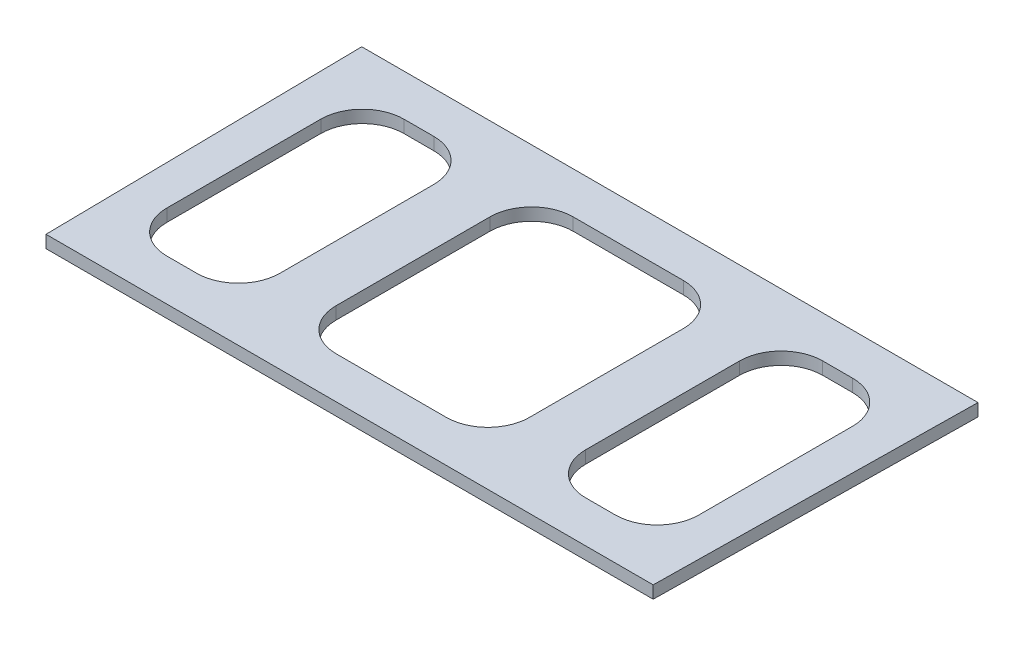
ISO-10303-21;
HEADER;
FILE_DESCRIPTION(('STEP AP214'),'2;1');
FILE_NAME('part.step','',(''),(''),'','','');
FILE_SCHEMA(('AUTOMOTIVE_DESIGN { 1 0 10303 214 1 1 1 1 }'));
ENDSEC;
DATA;
#1=APPLICATION_CONTEXT('core data for automotive mechanical design processes');
#2=APPLICATION_PROTOCOL_DEFINITION('international standard','automotive_design',2000,#1);
#3=PRODUCT_CONTEXT('',#1,'mechanical');
#4=PRODUCT('Part','Part','',(#3));
#5=PRODUCT_RELATED_PRODUCT_CATEGORY('part','',(#4));
#6=PRODUCT_DEFINITION_FORMATION('','',#4);
#7=PRODUCT_DEFINITION_CONTEXT('part definition',#1,'design');
#8=PRODUCT_DEFINITION('design','',#6,#7);
#9=PRODUCT_DEFINITION_SHAPE('','',#8);
#10=(LENGTH_UNIT() NAMED_UNIT(*) SI_UNIT(.MILLI.,.METRE.));
#11=(NAMED_UNIT(*) PLANE_ANGLE_UNIT() SI_UNIT($,.RADIAN.));
#12=(NAMED_UNIT(*) SI_UNIT($,.STERADIAN.) SOLID_ANGLE_UNIT());
#13=UNCERTAINTY_MEASURE_WITH_UNIT(LENGTH_MEASURE(1.E-05),#10,'distance_accuracy_value','');
#14=(GEOMETRIC_REPRESENTATION_CONTEXT(3) GLOBAL_UNCERTAINTY_ASSIGNED_CONTEXT((#13)) GLOBAL_UNIT_ASSIGNED_CONTEXT((#10,
#11,#12)) REPRESENTATION_CONTEXT('',''));
#15=CARTESIAN_POINT('',(0.,0.,0.));
#16=DIRECTION('',(0.,0.,1.));
#17=DIRECTION('',(1.,0.,0.));
#18=AXIS2_PLACEMENT_3D('',#15,#16,#17);
#19=CARTESIAN_POINT('',(0.,3.,0.));
#20=DIRECTION('',(0.,1.,0.));
#21=DIRECTION('',(0.,0.,1.));
#22=AXIS2_PLACEMENT_3D('',#19,#20,#21);
#23=PLANE('',#22);
#24=CARTESIAN_POINT('',(-46.75,3.,-57.));
#25=DIRECTION('',(0.,1.,0.));
#26=DIRECTION('',(0.,0.,-1.));
#27=AXIS2_PLACEMENT_3D('',#24,#25,#26);
#28=CIRCLE('',#27,9.99999999999999);
#29=CARTESIAN_POINT('',(-36.75,3.,-56.9999999999999));
#30=VERTEX_POINT('',#29);
#31=CARTESIAN_POINT('',(-46.7500000000001,3.,-67.));
#32=VERTEX_POINT('',#31);
#33=EDGE_CURVE('E302',#30,#32,#28,.T.);
#34=ORIENTED_EDGE('',*,*,#33,.F.);
#35=DIRECTION('',(0.,0.,-1.));
#36=VECTOR('',#35,1.);
#37=CARTESIAN_POINT('',(-36.75,3.,-56.9999999999999));
#38=LINE('',#37,#36);
#39=CARTESIAN_POINT('',(-36.75,3.,-20.0000000000001));
#40=VERTEX_POINT('',#39);
#41=EDGE_CURVE('E319',#40,#30,#38,.T.);
#42=ORIENTED_EDGE('',*,*,#41,.F.);
#43=CARTESIAN_POINT('',(-46.75,3.,-20.));
#44=DIRECTION('',(0.,1.,0.));
#45=DIRECTION('',(0.,0.,-1.));
#46=AXIS2_PLACEMENT_3D('',#43,#44,#45);
#47=CIRCLE('',#46,10.);
#48=CARTESIAN_POINT('',(-46.7500000000001,3.,-10.));
#49=VERTEX_POINT('',#48);
#50=EDGE_CURVE('E335',#49,#40,#47,.T.);
#51=ORIENTED_EDGE('',*,*,#50,.F.);
#52=DIRECTION('',(1.,0.,0.));
#53=VECTOR('',#52,1.);
#54=CARTESIAN_POINT('',(-46.7500000000001,3.,-10.));
#55=LINE('',#54,#53);
#56=CARTESIAN_POINT('',(-53.9326195310102,3.,-10.));
#57=VERTEX_POINT('',#56);
#58=EDGE_CURVE('E338',#57,#49,#55,.T.);
#59=ORIENTED_EDGE('',*,*,#58,.F.);
#60=CARTESIAN_POINT('',(-53.9326195310102,3.,-20.));
#61=DIRECTION('',(0.,1.,0.));
#62=DIRECTION('',(0.,0.,-1.));
#63=AXIS2_PLACEMENT_3D('',#60,#61,#62);
#64=CIRCLE('',#63,10.);
#65=CARTESIAN_POINT('',(-63.9326195310102,3.,-20.0000000000001));
#66=VERTEX_POINT('',#65);
#67=EDGE_CURVE('E341',#66,#57,#64,.T.);
#68=ORIENTED_EDGE('',*,*,#67,.F.);
#69=DIRECTION('',(0.,0.,1.));
#70=VECTOR('',#69,1.);
#71=CARTESIAN_POINT('',(-63.9326195310102,3.,-56.9999999999999));
#72=LINE('',#71,#70);
#73=CARTESIAN_POINT('',(-63.9326195310102,3.,-56.9999999999999));
#74=VERTEX_POINT('',#73);
#75=EDGE_CURVE('E344',#74,#66,#72,.T.);
#76=ORIENTED_EDGE('',*,*,#75,.F.);
#77=CARTESIAN_POINT('',(-53.9326195310102,3.,-57.));
#78=DIRECTION('',(0.,1.,0.));
#79=DIRECTION('',(0.,0.,1.));
#80=AXIS2_PLACEMENT_3D('',#77,#78,#79);
#81=CIRCLE('',#80,10.);
#82=CARTESIAN_POINT('',(-53.9326195310102,3.,-67.));
#83=VERTEX_POINT('',#82);
#84=EDGE_CURVE('E347',#83,#74,#81,.T.);
#85=ORIENTED_EDGE('',*,*,#84,.F.);
#86=DIRECTION('',(-1.,0.,0.));
#87=VECTOR('',#86,1.);
#88=CARTESIAN_POINT('',(-46.7500000000001,3.,-67.));
#89=LINE('',#88,#87);
#90=EDGE_CURVE('E350',#32,#83,#89,.T.);
#91=ORIENTED_EDGE('',*,*,#90,.F.);
#92=EDGE_LOOP('',(#34,#42,#51,#59,#68,#76,#85,#91));
#93=FACE_BOUND('',#92,.T.);
#94=DIRECTION('',(0.0141366960380366,0.,-0.999900071919753));
#95=VECTOR('',#94,1.);
#96=CARTESIAN_POINT('',(74.075,3.,-77.));
#97=LINE('',#96,#95);
#98=CARTESIAN_POINT('',(72.9863656199275,3.,0.));
#99=VERTEX_POINT('',#98);
#100=CARTESIAN_POINT('',(74.075,3.,-77.));
#101=VERTEX_POINT('',#100);
#102=EDGE_CURVE('E354',#99,#101,#97,.T.);
#103=ORIENTED_EDGE('',*,*,#102,.T.);
#104=DIRECTION('',(-1.,0.,0.));
#105=VECTOR('',#104,1.);
#106=CARTESIAN_POINT('',(-74.075,3.,-77.));
#107=LINE('',#106,#105);
#108=CARTESIAN_POINT('',(-74.075,3.,-77.));
#109=VERTEX_POINT('',#108);
#110=EDGE_CURVE('E357',#101,#109,#107,.T.);
#111=ORIENTED_EDGE('',*,*,#110,.T.);
#112=DIRECTION('',(0.0141366960380362,0.,0.999900071919753));
#113=VECTOR('',#112,1.);
#114=CARTESIAN_POINT('',(-72.9863656199275,3.,0.));
#115=LINE('',#114,#113);
#116=CARTESIAN_POINT('',(-72.9863656199275,3.,0.));
#117=VERTEX_POINT('',#116);
#118=EDGE_CURVE('E360',#109,#117,#115,.T.);
#119=ORIENTED_EDGE('',*,*,#118,.T.);
#120=DIRECTION('',(1.,0.,0.));
#121=VECTOR('',#120,1.);
#122=CARTESIAN_POINT('',(-72.9863656199275,3.,0.));
#123=LINE('',#122,#121);
#124=EDGE_CURVE('E362',#117,#99,#123,.T.);
#125=ORIENTED_EDGE('',*,*,#124,.T.);
#126=EDGE_LOOP('',(#103,#111,#119,#125));
#127=FACE_BOUND('',#126,.T.);
#128=DIRECTION('',(0.,0.,-1.));
#129=VECTOR('',#128,1.);
#130=CARTESIAN_POINT('',(36.75,3.,-56.9999999999999));
#131=LINE('',#130,#129);
#132=CARTESIAN_POINT('',(36.75,3.,-20.0000000000001));
#133=VERTEX_POINT('',#132);
#134=CARTESIAN_POINT('',(36.75,3.,-56.9999999999999));
#135=VERTEX_POINT('',#134);
#136=EDGE_CURVE('E265',#133,#135,#131,.T.);
#137=ORIENTED_EDGE('',*,*,#136,.T.);
#138=CARTESIAN_POINT('',(46.75,3.,-57.));
#139=DIRECTION('',(0.,-1.,0.));
#140=DIRECTION('',(0.,0.,-1.));
#141=AXIS2_PLACEMENT_3D('',#138,#139,#140);
#142=CIRCLE('',#141,9.99999999999999);
#143=CARTESIAN_POINT('',(46.7500000000001,3.,-67.));
#144=VERTEX_POINT('',#143);
#145=EDGE_CURVE('E52',#135,#144,#142,.T.);
#146=ORIENTED_EDGE('',*,*,#145,.T.);
#147=DIRECTION('',(1.,0.,0.));
#148=VECTOR('',#147,1.);
#149=CARTESIAN_POINT('',(46.7500000000001,3.,-67.));
#150=LINE('',#149,#148);
#151=CARTESIAN_POINT('',(53.9326195310102,3.,-67.));
#152=VERTEX_POINT('',#151);
#153=EDGE_CURVE('E283',#144,#152,#150,.T.);
#154=ORIENTED_EDGE('',*,*,#153,.T.);
#155=CARTESIAN_POINT('',(53.9326195310102,3.,-57.));
#156=DIRECTION('',(0.,-1.,0.));
#157=DIRECTION('',(0.,0.,1.));
#158=AXIS2_PLACEMENT_3D('',#155,#156,#157);
#159=CIRCLE('',#158,10.);
#160=CARTESIAN_POINT('',(63.9326195310102,3.,-56.9999999999999));
#161=VERTEX_POINT('',#160);
#162=EDGE_CURVE('E280',#152,#161,#159,.T.);
#163=ORIENTED_EDGE('',*,*,#162,.T.);
#164=DIRECTION('',(0.,0.,1.));
#165=VECTOR('',#164,1.);
#166=CARTESIAN_POINT('',(63.9326195310102,3.,-56.9999999999999));
#167=LINE('',#166,#165);
#168=CARTESIAN_POINT('',(63.9326195310102,3.,-20.0000000000001));
#169=VERTEX_POINT('',#168);
#170=EDGE_CURVE('E277',#161,#169,#167,.T.);
#171=ORIENTED_EDGE('',*,*,#170,.T.);
#172=CARTESIAN_POINT('',(53.9326195310102,3.,-20.));
#173=DIRECTION('',(0.,-1.,0.));
#174=DIRECTION('',(0.,0.,-1.));
#175=AXIS2_PLACEMENT_3D('',#172,#173,#174);
#176=CIRCLE('',#175,10.);
#177=CARTESIAN_POINT('',(53.9326195310102,3.,-10.));
#178=VERTEX_POINT('',#177);
#179=EDGE_CURVE('E274',#169,#178,#176,.T.);
#180=ORIENTED_EDGE('',*,*,#179,.T.);
#181=DIRECTION('',(-1.,0.,0.));
#182=VECTOR('',#181,1.);
#183=CARTESIAN_POINT('',(46.7500000000001,3.,-10.));
#184=LINE('',#183,#182);
#185=CARTESIAN_POINT('',(46.7500000000001,3.,-10.));
#186=VERTEX_POINT('',#185);
#187=EDGE_CURVE('E271',#178,#186,#184,.T.);
#188=ORIENTED_EDGE('',*,*,#187,.T.);
#189=CARTESIAN_POINT('',(46.75,3.,-20.));
#190=DIRECTION('',(0.,-1.,0.));
#191=DIRECTION('',(0.,0.,-1.));
#192=AXIS2_PLACEMENT_3D('',#189,#190,#191);
#193=CIRCLE('',#192,10.);
#194=EDGE_CURVE('E268',#186,#133,#193,.T.);
#195=ORIENTED_EDGE('',*,*,#194,.T.);
#196=EDGE_LOOP('',(#137,#146,#154,#163,#171,#180,#188,#195));
#197=FACE_BOUND('',#196,.T.);
#198=DIRECTION('',(-1.,0.,0.));
#199=VECTOR('',#198,1.);
#200=CARTESIAN_POINT('',(-13.2499999999999,3.,-67.));
#201=LINE('',#200,#199);
#202=CARTESIAN_POINT('',(13.2499999999999,3.,-67.));
#203=VERTEX_POINT('',#202);
#204=CARTESIAN_POINT('',(-13.2499999999999,3.,-67.));
#205=VERTEX_POINT('',#204);
#206=EDGE_CURVE('E298',#203,#205,#201,.T.);
#207=ORIENTED_EDGE('',*,*,#206,.F.);
#208=CARTESIAN_POINT('',(13.25,3.,-57.));
#209=DIRECTION('',(0.,-1.,0.));
#210=DIRECTION('',(0.,0.,1.));
#211=AXIS2_PLACEMENT_3D('',#208,#209,#210);
#212=CIRCLE('',#211,10.);
#213=CARTESIAN_POINT('',(23.25,3.,-56.9999999999999));
#214=VERTEX_POINT('',#213);
#215=EDGE_CURVE('E245',#203,#214,#212,.T.);
#216=ORIENTED_EDGE('',*,*,#215,.T.);
#217=DIRECTION('',(0.,0.,1.));
#218=VECTOR('',#217,1.);
#219=CARTESIAN_POINT('',(23.25,3.,-56.9999999999999));
#220=LINE('',#219,#218);
#221=CARTESIAN_POINT('',(23.25,3.,-20.0000000000001));
#222=VERTEX_POINT('',#221);
#223=EDGE_CURVE('E249',#214,#222,#220,.T.);
#224=ORIENTED_EDGE('',*,*,#223,.T.);
#225=CARTESIAN_POINT('',(13.25,3.,-20.));
#226=DIRECTION('',(0.,-1.,0.));
#227=DIRECTION('',(0.,0.,1.));
#228=AXIS2_PLACEMENT_3D('',#225,#226,#227);
#229=CIRCLE('',#228,10.);
#230=CARTESIAN_POINT('',(13.2499999999999,3.,-10.));
#231=VERTEX_POINT('',#230);
#232=EDGE_CURVE('E240',#222,#231,#229,.T.);
#233=ORIENTED_EDGE('',*,*,#232,.T.);
#234=DIRECTION('',(1.,0.,0.));
#235=VECTOR('',#234,1.);
#236=CARTESIAN_POINT('',(-13.2499999999999,3.,-10.));
#237=LINE('',#236,#235);
#238=CARTESIAN_POINT('',(-13.2499999999999,3.,-10.));
#239=VERTEX_POINT('',#238);
#240=EDGE_CURVE('E222',#239,#231,#237,.T.);
#241=ORIENTED_EDGE('',*,*,#240,.F.);
#242=CARTESIAN_POINT('',(-13.25,3.,-20.));
#243=DIRECTION('',(0.,1.,0.));
#244=DIRECTION('',(0.,0.,1.));
#245=AXIS2_PLACEMENT_3D('',#242,#243,#244);
#246=CIRCLE('',#245,10.);
#247=CARTESIAN_POINT('',(-23.25,3.,-20.0000000000001));
#248=VERTEX_POINT('',#247);
#249=EDGE_CURVE('E233',#248,#239,#246,.T.);
#250=ORIENTED_EDGE('',*,*,#249,.F.);
#251=DIRECTION('',(0.,0.,1.));
#252=VECTOR('',#251,1.);
#253=CARTESIAN_POINT('',(-23.25,3.,-56.9999999999999));
#254=LINE('',#253,#252);
#255=CARTESIAN_POINT('',(-23.25,3.,-56.9999999999999));
#256=VERTEX_POINT('',#255);
#257=EDGE_CURVE('E305',#256,#248,#254,.T.);
#258=ORIENTED_EDGE('',*,*,#257,.F.);
#259=CARTESIAN_POINT('',(-13.25,3.,-57.));
#260=DIRECTION('',(0.,1.,0.));
#261=DIRECTION('',(0.,0.,1.));
#262=AXIS2_PLACEMENT_3D('',#259,#260,#261);
#263=CIRCLE('',#262,10.);
#264=EDGE_CURVE('E301',#205,#256,#263,.T.);
#265=ORIENTED_EDGE('',*,*,#264,.F.);
#266=EDGE_LOOP('',(#207,#216,#224,#233,#241,#250,#258,#265));
#267=FACE_BOUND('',#266,.T.);
#268=ADVANCED_FACE('F37',(#93,#127,#197,#267),#23,.T.);
#269=CARTESIAN_POINT('',(0.,0.,0.));
#270=DIRECTION('',(0.,1.,0.));
#271=DIRECTION('',(0.,0.,1.));
#272=AXIS2_PLACEMENT_3D('',#269,#270,#271);
#273=PLANE('',#272);
#274=CARTESIAN_POINT('',(46.75,0.,-57.));
#275=DIRECTION('',(0.,1.,0.));
#276=DIRECTION('',(0.,0.,1.));
#277=AXIS2_PLACEMENT_3D('',#274,#275,#276);
#278=CIRCLE('',#277,9.99999999999999);
#279=CARTESIAN_POINT('',(36.75,0.,-56.9999999999999));
#280=VERTEX_POINT('',#279);
#281=CARTESIAN_POINT('',(46.7500000000001,0.,-67.));
#282=VERTEX_POINT('',#281);
#283=EDGE_CURVE('E435',#280,#282,#278,.F.);
#284=ORIENTED_EDGE('',*,*,#283,.F.);
#285=DIRECTION('',(0.,0.,-1.));
#286=VECTOR('',#285,1.);
#287=CARTESIAN_POINT('',(36.75,0.,0.));
#288=LINE('',#287,#286);
#289=CARTESIAN_POINT('',(36.75,0.,-20.0000000000001));
#290=VERTEX_POINT('',#289);
#291=EDGE_CURVE('E421',#290,#280,#288,.T.);
#292=ORIENTED_EDGE('',*,*,#291,.F.);
#293=CARTESIAN_POINT('',(46.75,0.,-20.));
#294=DIRECTION('',(0.,1.,0.));
#295=DIRECTION('',(0.,0.,1.));
#296=AXIS2_PLACEMENT_3D('',#293,#294,#295);
#297=CIRCLE('',#296,10.);
#298=CARTESIAN_POINT('',(46.7500000000001,0.,-10.));
#299=VERTEX_POINT('',#298);
#300=EDGE_CURVE('E423',#299,#290,#297,.F.);
#301=ORIENTED_EDGE('',*,*,#300,.F.);
#302=DIRECTION('',(-1.,0.,0.));
#303=VECTOR('',#302,1.);
#304=CARTESIAN_POINT('',(0.,0.,-10.));
#305=LINE('',#304,#303);
#306=CARTESIAN_POINT('',(53.9326195310102,0.,-10.));
#307=VERTEX_POINT('',#306);
#308=EDGE_CURVE('E425',#307,#299,#305,.T.);
#309=ORIENTED_EDGE('',*,*,#308,.F.);
#310=CARTESIAN_POINT('',(53.9326195310102,0.,-20.));
#311=DIRECTION('',(0.,1.,0.));
#312=DIRECTION('',(0.,0.,1.));
#313=AXIS2_PLACEMENT_3D('',#310,#311,#312);
#314=CIRCLE('',#313,10.);
#315=CARTESIAN_POINT('',(63.9326195310102,0.,-20.0000000000001));
#316=VERTEX_POINT('',#315);
#317=EDGE_CURVE('E427',#316,#307,#314,.F.);
#318=ORIENTED_EDGE('',*,*,#317,.F.);
#319=DIRECTION('',(0.,0.,1.));
#320=VECTOR('',#319,1.);
#321=CARTESIAN_POINT('',(63.9326195310102,0.,0.));
#322=LINE('',#321,#320);
#323=CARTESIAN_POINT('',(63.9326195310102,0.,-56.9999999999999));
#324=VERTEX_POINT('',#323);
#325=EDGE_CURVE('E429',#324,#316,#322,.T.);
#326=ORIENTED_EDGE('',*,*,#325,.F.);
#327=CARTESIAN_POINT('',(53.9326195310102,0.,-57.));
#328=DIRECTION('',(0.,1.,0.));
#329=DIRECTION('',(0.,0.,1.));
#330=AXIS2_PLACEMENT_3D('',#327,#328,#329);
#331=CIRCLE('',#330,10.);
#332=CARTESIAN_POINT('',(53.9326195310102,0.,-67.));
#333=VERTEX_POINT('',#332);
#334=EDGE_CURVE('E431',#333,#324,#331,.F.);
#335=ORIENTED_EDGE('',*,*,#334,.F.);
#336=DIRECTION('',(1.,0.,0.));
#337=VECTOR('',#336,1.);
#338=CARTESIAN_POINT('',(0.,0.,-67.));
#339=LINE('',#338,#337);
#340=EDGE_CURVE('E433',#282,#333,#339,.T.);
#341=ORIENTED_EDGE('',*,*,#340,.F.);
#342=EDGE_LOOP('',(#284,#292,#301,#309,#318,#326,#335,#341));
#343=FACE_BOUND('',#342,.T.);
#344=DIRECTION('',(0.,0.,-1.));
#345=VECTOR('',#344,1.);
#346=CARTESIAN_POINT('',(-36.75,0.,0.));
#347=LINE('',#346,#345);
#348=CARTESIAN_POINT('',(-36.75,0.,-20.0000000000001));
#349=VERTEX_POINT('',#348);
#350=CARTESIAN_POINT('',(-36.75,0.,-56.9999999999999));
#351=VERTEX_POINT('',#350);
#352=EDGE_CURVE('E401',#349,#351,#347,.T.);
#353=ORIENTED_EDGE('',*,*,#352,.T.);
#354=CARTESIAN_POINT('',(-46.75,0.,-57.));
#355=DIRECTION('',(0.,1.,0.));
#356=DIRECTION('',(0.,0.,1.));
#357=AXIS2_PLACEMENT_3D('',#354,#355,#356);
#358=CIRCLE('',#357,9.99999999999999);
#359=CARTESIAN_POINT('',(-46.7500000000001,0.,-67.));
#360=VERTEX_POINT('',#359);
#361=EDGE_CURVE('E404',#351,#360,#358,.T.);
#362=ORIENTED_EDGE('',*,*,#361,.T.);
#363=DIRECTION('',(-1.,0.,0.));
#364=VECTOR('',#363,1.);
#365=CARTESIAN_POINT('',(0.,0.,-67.));
#366=LINE('',#365,#364);
#367=CARTESIAN_POINT('',(-53.9326195310102,0.,-67.));
#368=VERTEX_POINT('',#367);
#369=EDGE_CURVE('E383',#360,#368,#366,.T.);
#370=ORIENTED_EDGE('',*,*,#369,.T.);
#371=CARTESIAN_POINT('',(-53.9326195310102,0.,-57.));
#372=DIRECTION('',(0.,1.,0.));
#373=DIRECTION('',(0.,0.,1.));
#374=AXIS2_PLACEMENT_3D('',#371,#372,#373);
#375=CIRCLE('',#374,10.);
#376=CARTESIAN_POINT('',(-63.9326195310102,0.,-56.9999999999999));
#377=VERTEX_POINT('',#376);
#378=EDGE_CURVE('E386',#368,#377,#375,.T.);
#379=ORIENTED_EDGE('',*,*,#378,.T.);
#380=DIRECTION('',(0.,0.,1.));
#381=VECTOR('',#380,1.);
#382=CARTESIAN_POINT('',(-63.9326195310102,0.,0.));
#383=LINE('',#382,#381);
#384=CARTESIAN_POINT('',(-63.9326195310102,0.,-20.0000000000001));
#385=VERTEX_POINT('',#384);
#386=EDGE_CURVE('E389',#377,#385,#383,.T.);
#387=ORIENTED_EDGE('',*,*,#386,.T.);
#388=CARTESIAN_POINT('',(-53.9326195310102,0.,-20.));
#389=DIRECTION('',(0.,1.,0.));
#390=DIRECTION('',(0.,0.,1.));
#391=AXIS2_PLACEMENT_3D('',#388,#389,#390);
#392=CIRCLE('',#391,10.);
#393=CARTESIAN_POINT('',(-53.9326195310102,0.,-10.));
#394=VERTEX_POINT('',#393);
#395=EDGE_CURVE('E392',#385,#394,#392,.T.);
#396=ORIENTED_EDGE('',*,*,#395,.T.);
#397=DIRECTION('',(1.,0.,0.));
#398=VECTOR('',#397,1.);
#399=CARTESIAN_POINT('',(0.,0.,-10.));
#400=LINE('',#399,#398);
#401=CARTESIAN_POINT('',(-46.7500000000001,0.,-10.));
#402=VERTEX_POINT('',#401);
#403=EDGE_CURVE('E395',#394,#402,#400,.T.);
#404=ORIENTED_EDGE('',*,*,#403,.T.);
#405=CARTESIAN_POINT('',(-46.75,0.,-20.));
#406=DIRECTION('',(0.,1.,0.));
#407=DIRECTION('',(0.,0.,1.));
#408=AXIS2_PLACEMENT_3D('',#405,#406,#407);
#409=CIRCLE('',#408,10.);
#410=EDGE_CURVE('E398',#402,#349,#409,.T.);
#411=ORIENTED_EDGE('',*,*,#410,.T.);
#412=EDGE_LOOP('',(#353,#362,#370,#379,#387,#396,#404,#411));
#413=FACE_BOUND('',#412,.T.);
#414=DIRECTION('',(0.0141366960380366,0.,-0.999900071919753));
#415=VECTOR('',#414,1.);
#416=CARTESIAN_POINT('',(74.075,0.,-77.));
#417=LINE('',#416,#415);
#418=CARTESIAN_POINT('',(72.9863656199275,0.,0.));
#419=VERTEX_POINT('',#418);
#420=CARTESIAN_POINT('',(74.075,0.,-77.));
#421=VERTEX_POINT('',#420);
#422=EDGE_CURVE('E310',#419,#421,#417,.T.);
#423=ORIENTED_EDGE('',*,*,#422,.F.);
#424=DIRECTION('',(1.,0.,0.));
#425=VECTOR('',#424,1.);
#426=CARTESIAN_POINT('',(-72.9863656199275,0.,0.));
#427=LINE('',#426,#425);
#428=CARTESIAN_POINT('',(-72.9863656199275,0.,0.));
#429=VERTEX_POINT('',#428);
#430=EDGE_CURVE('E358',#429,#419,#427,.T.);
#431=ORIENTED_EDGE('',*,*,#430,.F.);
#432=DIRECTION('',(0.0141366960380362,0.,0.999900071919753));
#433=VECTOR('',#432,1.);
#434=CARTESIAN_POINT('',(-72.9863656199275,0.,0.));
#435=LINE('',#434,#433);
#436=CARTESIAN_POINT('',(-74.075,0.,-77.));
#437=VERTEX_POINT('',#436);
#438=EDGE_CURVE('E369',#437,#429,#435,.T.);
#439=ORIENTED_EDGE('',*,*,#438,.F.);
#440=DIRECTION('',(-1.,0.,0.));
#441=VECTOR('',#440,1.);
#442=CARTESIAN_POINT('',(-74.075,0.,-77.));
#443=LINE('',#442,#441);
#444=EDGE_CURVE('E367',#421,#437,#443,.T.);
#445=ORIENTED_EDGE('',*,*,#444,.F.);
#446=EDGE_LOOP('',(#423,#431,#439,#445));
#447=FACE_BOUND('',#446,.T.);
#448=CARTESIAN_POINT('',(13.25,0.,-57.));
#449=DIRECTION('',(0.,1.,0.));
#450=DIRECTION('',(0.,0.,1.));
#451=AXIS2_PLACEMENT_3D('',#448,#449,#450);
#452=CIRCLE('',#451,10.);
#453=CARTESIAN_POINT('',(13.2499999999999,0.,-67.));
#454=VERTEX_POINT('',#453);
#455=CARTESIAN_POINT('',(23.25,0.,-56.9999999999999));
#456=VERTEX_POINT('',#455);
#457=EDGE_CURVE('E11',#454,#456,#452,.F.);
#458=ORIENTED_EDGE('',*,*,#457,.F.);
#459=DIRECTION('',(-1.,0.,0.));
#460=VECTOR('',#459,1.);
#461=CARTESIAN_POINT('',(0.,0.,-67.));
#462=LINE('',#461,#460);
#463=CARTESIAN_POINT('',(-13.2499999999999,0.,-67.));
#464=VERTEX_POINT('',#463);
#465=EDGE_CURVE('E407',#454,#464,#462,.T.);
#466=ORIENTED_EDGE('',*,*,#465,.T.);
#467=CARTESIAN_POINT('',(-13.25,0.,-57.));
#468=DIRECTION('',(0.,1.,0.));
#469=DIRECTION('',(0.,0.,1.));
#470=AXIS2_PLACEMENT_3D('',#467,#468,#469);
#471=CIRCLE('',#470,10.);
#472=CARTESIAN_POINT('',(-23.25,0.,-56.9999999999999));
#473=VERTEX_POINT('',#472);
#474=EDGE_CURVE('E410',#464,#473,#471,.T.);
#475=ORIENTED_EDGE('',*,*,#474,.T.);
#476=DIRECTION('',(0.,0.,1.));
#477=VECTOR('',#476,1.);
#478=CARTESIAN_POINT('',(-23.25,0.,0.));
#479=LINE('',#478,#477);
#480=CARTESIAN_POINT('',(-23.25,0.,-20.0000000000001));
#481=VERTEX_POINT('',#480);
#482=EDGE_CURVE('E413',#473,#481,#479,.T.);
#483=ORIENTED_EDGE('',*,*,#482,.T.);
#484=CARTESIAN_POINT('',(-13.25,0.,-20.));
#485=DIRECTION('',(0.,1.,0.));
#486=DIRECTION('',(0.,0.,1.));
#487=AXIS2_PLACEMENT_3D('',#484,#485,#486);
#488=CIRCLE('',#487,10.);
#489=CARTESIAN_POINT('',(-13.2499999999999,0.,-10.));
#490=VERTEX_POINT('',#489);
#491=EDGE_CURVE('E416',#481,#490,#488,.T.);
#492=ORIENTED_EDGE('',*,*,#491,.T.);
#493=DIRECTION('',(1.,0.,0.));
#494=VECTOR('',#493,1.);
#495=CARTESIAN_POINT('',(0.,0.,-10.));
#496=LINE('',#495,#494);
#497=CARTESIAN_POINT('',(13.2499999999999,0.,-10.));
#498=VERTEX_POINT('',#497);
#499=EDGE_CURVE('E419',#490,#498,#496,.T.);
#500=ORIENTED_EDGE('',*,*,#499,.T.);
#501=CARTESIAN_POINT('',(13.25,0.,-20.));
#502=DIRECTION('',(0.,1.,0.));
#503=DIRECTION('',(0.,0.,1.));
#504=AXIS2_PLACEMENT_3D('',#501,#502,#503);
#505=CIRCLE('',#504,10.);
#506=CARTESIAN_POINT('',(23.25,0.,-20.0000000000001));
#507=VERTEX_POINT('',#506);
#508=EDGE_CURVE('E243',#507,#498,#505,.F.);
#509=ORIENTED_EDGE('',*,*,#508,.F.);
#510=DIRECTION('',(0.,0.,1.));
#511=VECTOR('',#510,1.);
#512=CARTESIAN_POINT('',(23.25,0.,0.));
#513=LINE('',#512,#511);
#514=EDGE_CURVE('E45',#456,#507,#513,.T.);
#515=ORIENTED_EDGE('',*,*,#514,.F.);
#516=EDGE_LOOP('',(#458,#466,#475,#483,#492,#500,#509,#515));
#517=FACE_BOUND('',#516,.T.);
#518=ADVANCED_FACE('F443',(#343,#413,#447,#517),#273,.F.);
#519=CARTESIAN_POINT('',(74.075,3.,-77.));
#520=DIRECTION('',(-0.999900071919753,0.,-0.0141366960380366));
#521=DIRECTION('',(-0.0141366960380366,0.,0.999900071919754));
#522=AXIS2_PLACEMENT_3D('',#519,#520,#521);
#523=PLANE('',#522);
#524=ORIENTED_EDGE('',*,*,#422,.T.);
#525=DIRECTION('',(0.,-1.,0.));
#526=VECTOR('',#525,1.);
#527=CARTESIAN_POINT('',(74.075,3.,-77.));
#528=LINE('',#527,#526);
#529=EDGE_CURVE('E380',#101,#421,#528,.T.);
#530=ORIENTED_EDGE('',*,*,#529,.F.);
#531=ORIENTED_EDGE('',*,*,#102,.F.);
#532=DIRECTION('',(0.,-1.,0.));
#533=VECTOR('',#532,1.);
#534=CARTESIAN_POINT('',(72.9863656199275,3.,0.));
#535=LINE('',#534,#533);
#536=EDGE_CURVE('E364',#99,#419,#535,.T.);
#537=ORIENTED_EDGE('',*,*,#536,.T.);
#538=EDGE_LOOP('',(#524,#530,#531,#537));
#539=FACE_BOUND('',#538,.T.);
#540=ADVANCED_FACE('F39',(#539),#523,.F.);
#541=CARTESIAN_POINT('',(-74.075,3.,-77.));
#542=DIRECTION('',(0.,0.,1.));
#543=DIRECTION('',(1.,0.,0.));
#544=AXIS2_PLACEMENT_3D('',#541,#542,#543);
#545=PLANE('',#544);
#546=ORIENTED_EDGE('',*,*,#444,.T.);
#547=DIRECTION('',(0.,-1.,0.));
#548=VECTOR('',#547,1.);
#549=CARTESIAN_POINT('',(-74.075,3.,-77.));
#550=LINE('',#549,#548);
#551=EDGE_CURVE('E377',#109,#437,#550,.T.);
#552=ORIENTED_EDGE('',*,*,#551,.F.);
#553=ORIENTED_EDGE('',*,*,#110,.F.);
#554=ORIENTED_EDGE('',*,*,#529,.T.);
#555=EDGE_LOOP('',(#546,#552,#553,#554));
#556=FACE_BOUND('',#555,.T.);
#557=ADVANCED_FACE('F491',(#556),#545,.F.);
#558=CARTESIAN_POINT('',(-72.9863656199275,3.,0.));
#559=DIRECTION('',(0.999900071919754,0.,-0.0141366960380362));
#560=DIRECTION('',(-0.0141366960380362,0.,-0.999900071919754));
#561=AXIS2_PLACEMENT_3D('',#558,#559,#560);
#562=PLANE('',#561);
#563=ORIENTED_EDGE('',*,*,#438,.T.);
#564=DIRECTION('',(0.,-1.,0.));
#565=VECTOR('',#564,1.);
#566=CARTESIAN_POINT('',(-72.9863656199275,3.,0.));
#567=LINE('',#566,#565);
#568=EDGE_CURVE('E374',#117,#429,#567,.T.);
#569=ORIENTED_EDGE('',*,*,#568,.F.);
#570=ORIENTED_EDGE('',*,*,#118,.F.);
#571=ORIENTED_EDGE('',*,*,#551,.T.);
#572=EDGE_LOOP('',(#563,#569,#570,#571));
#573=FACE_BOUND('',#572,.T.);
#574=ADVANCED_FACE('F488',(#573),#562,.F.);
#575=CARTESIAN_POINT('',(-72.9863656199275,3.,0.));
#576=DIRECTION('',(0.,0.,-1.));
#577=DIRECTION('',(-1.,0.,0.));
#578=AXIS2_PLACEMENT_3D('',#575,#576,#577);
#579=PLANE('',#578);
#580=ORIENTED_EDGE('',*,*,#430,.T.);
#581=ORIENTED_EDGE('',*,*,#536,.F.);
#582=ORIENTED_EDGE('',*,*,#124,.F.);
#583=ORIENTED_EDGE('',*,*,#568,.T.);
#584=EDGE_LOOP('',(#580,#581,#582,#583));
#585=FACE_BOUND('',#584,.T.);
#586=ADVANCED_FACE('F484',(#585),#579,.F.);
#587=CARTESIAN_POINT('',(-46.75,-7.,-57.));
#588=DIRECTION('',(0.,1.,0.));
#589=DIRECTION('',(0.,0.,1.));
#590=AXIS2_PLACEMENT_3D('',#587,#588,#589);
#591=CYLINDRICAL_SURFACE('',#590,9.99999999999999);
#592=DIRECTION('',(0.,1.,0.));
#593=VECTOR('',#592,1.);
#594=CARTESIAN_POINT('',(-36.75,-7.,-56.9999999999999));
#595=LINE('',#594,#593);
#596=EDGE_CURVE('E260',#351,#30,#595,.T.);
#597=ORIENTED_EDGE('',*,*,#596,.T.);
#598=ORIENTED_EDGE('',*,*,#33,.T.);
#599=DIRECTION('',(0.,1.,0.));
#600=VECTOR('',#599,1.);
#601=CARTESIAN_POINT('',(-46.7500000000001,-7.,-67.));
#602=LINE('',#601,#600);
#603=EDGE_CURVE('E316',#360,#32,#602,.T.);
#604=ORIENTED_EDGE('',*,*,#603,.F.);
#605=ORIENTED_EDGE('',*,*,#361,.F.);
#606=EDGE_LOOP('',(#597,#598,#604,#605));
#607=FACE_BOUND('',#606,.T.);
#608=ADVANCED_FACE('F487',(#607),#591,.F.);
#609=CARTESIAN_POINT('',(-36.75,-7.,-56.9999999999999));
#610=DIRECTION('',(1.,0.,0.));
#611=DIRECTION('',(0.,0.,-1.));
#612=AXIS2_PLACEMENT_3D('',#609,#610,#611);
#613=PLANE('',#612);
#614=DIRECTION('',(0.,1.,0.));
#615=VECTOR('',#614,1.);
#616=CARTESIAN_POINT('',(-36.75,-7.,-20.0000000000001));
#617=LINE('',#616,#615);
#618=EDGE_CURVE('E330',#349,#40,#617,.T.);
#619=ORIENTED_EDGE('',*,*,#618,.T.);
#620=ORIENTED_EDGE('',*,*,#41,.T.);
#621=ORIENTED_EDGE('',*,*,#596,.F.);
#622=ORIENTED_EDGE('',*,*,#352,.F.);
#623=EDGE_LOOP('',(#619,#620,#621,#622));
#624=FACE_BOUND('',#623,.T.);
#625=ADVANCED_FACE('F481',(#624),#613,.F.);
#626=CARTESIAN_POINT('',(-46.75,-7.,-20.));
#627=DIRECTION('',(0.,1.,0.));
#628=DIRECTION('',(0.,0.,1.));
#629=AXIS2_PLACEMENT_3D('',#626,#627,#628);
#630=CYLINDRICAL_SURFACE('',#629,10.);
#631=DIRECTION('',(0.,1.,0.));
#632=VECTOR('',#631,1.);
#633=CARTESIAN_POINT('',(-46.7500000000001,-7.,-10.));
#634=LINE('',#633,#632);
#635=EDGE_CURVE('E328',#402,#49,#634,.T.);
#636=ORIENTED_EDGE('',*,*,#635,.T.);
#637=ORIENTED_EDGE('',*,*,#50,.T.);
#638=ORIENTED_EDGE('',*,*,#618,.F.);
#639=ORIENTED_EDGE('',*,*,#410,.F.);
#640=EDGE_LOOP('',(#636,#637,#638,#639));
#641=FACE_BOUND('',#640,.T.);
#642=ADVANCED_FACE('F587',(#641),#630,.F.);
#643=CARTESIAN_POINT('',(-46.7500000000001,-7.,-10.));
#644=DIRECTION('',(0.,0.,1.));
#645=DIRECTION('',(1.,0.,0.));
#646=AXIS2_PLACEMENT_3D('',#643,#644,#645);
#647=PLANE('',#646);
#648=DIRECTION('',(0.,1.,0.));
#649=VECTOR('',#648,1.);
#650=CARTESIAN_POINT('',(-53.9326195310102,-7.,-10.));
#651=LINE('',#650,#649);
#652=EDGE_CURVE('E326',#394,#57,#651,.T.);
#653=ORIENTED_EDGE('',*,*,#652,.T.);
#654=ORIENTED_EDGE('',*,*,#58,.T.);
#655=ORIENTED_EDGE('',*,*,#635,.F.);
#656=ORIENTED_EDGE('',*,*,#403,.F.);
#657=EDGE_LOOP('',(#653,#654,#655,#656));
#658=FACE_BOUND('',#657,.T.);
#659=ADVANCED_FACE('F584',(#658),#647,.F.);
#660=CARTESIAN_POINT('',(-53.9326195310102,-7.,-20.));
#661=DIRECTION('',(0.,1.,0.));
#662=DIRECTION('',(0.,0.,1.));
#663=AXIS2_PLACEMENT_3D('',#660,#661,#662);
#664=CYLINDRICAL_SURFACE('',#663,10.);
#665=DIRECTION('',(0.,1.,0.));
#666=VECTOR('',#665,1.);
#667=CARTESIAN_POINT('',(-63.9326195310102,-7.,-20.0000000000001));
#668=LINE('',#667,#666);
#669=EDGE_CURVE('E324',#385,#66,#668,.T.);
#670=ORIENTED_EDGE('',*,*,#669,.T.);
#671=ORIENTED_EDGE('',*,*,#67,.T.);
#672=ORIENTED_EDGE('',*,*,#652,.F.);
#673=ORIENTED_EDGE('',*,*,#395,.F.);
#674=EDGE_LOOP('',(#670,#671,#672,#673));
#675=FACE_BOUND('',#674,.T.);
#676=ADVANCED_FACE('F580',(#675),#664,.F.);
#677=CARTESIAN_POINT('',(-63.9326195310102,-7.,-56.9999999999999));
#678=DIRECTION('',(-1.,0.,0.));
#679=DIRECTION('',(0.,0.,1.));
#680=AXIS2_PLACEMENT_3D('',#677,#678,#679);
#681=PLANE('',#680);
#682=DIRECTION('',(0.,1.,0.));
#683=VECTOR('',#682,1.);
#684=CARTESIAN_POINT('',(-63.9326195310102,-7.,-56.9999999999999));
#685=LINE('',#684,#683);
#686=EDGE_CURVE('E322',#377,#74,#685,.T.);
#687=ORIENTED_EDGE('',*,*,#686,.T.);
#688=ORIENTED_EDGE('',*,*,#75,.T.);
#689=ORIENTED_EDGE('',*,*,#669,.F.);
#690=ORIENTED_EDGE('',*,*,#386,.F.);
#691=EDGE_LOOP('',(#687,#688,#689,#690));
#692=FACE_BOUND('',#691,.T.);
#693=ADVANCED_FACE('F576',(#692),#681,.F.);
#694=CARTESIAN_POINT('',(-53.9326195310102,-7.,-57.));
#695=DIRECTION('',(0.,1.,0.));
#696=DIRECTION('',(0.,0.,1.));
#697=AXIS2_PLACEMENT_3D('',#694,#695,#696);
#698=CYLINDRICAL_SURFACE('',#697,10.);
#699=DIRECTION('',(0.,1.,0.));
#700=VECTOR('',#699,1.);
#701=CARTESIAN_POINT('',(-53.9326195310102,-7.,-67.));
#702=LINE('',#701,#700);
#703=EDGE_CURVE('E320',#368,#83,#702,.T.);
#704=ORIENTED_EDGE('',*,*,#703,.T.);
#705=ORIENTED_EDGE('',*,*,#84,.T.);
#706=ORIENTED_EDGE('',*,*,#686,.F.);
#707=ORIENTED_EDGE('',*,*,#378,.F.);
#708=EDGE_LOOP('',(#704,#705,#706,#707));
#709=FACE_BOUND('',#708,.T.);
#710=ADVANCED_FACE('F572',(#709),#698,.F.);
#711=CARTESIAN_POINT('',(-46.7500000000001,-7.,-67.));
#712=DIRECTION('',(0.,0.,-1.));
#713=DIRECTION('',(-1.,0.,0.));
#714=AXIS2_PLACEMENT_3D('',#711,#712,#713);
#715=PLANE('',#714);
#716=ORIENTED_EDGE('',*,*,#603,.T.);
#717=ORIENTED_EDGE('',*,*,#90,.T.);
#718=ORIENTED_EDGE('',*,*,#703,.F.);
#719=ORIENTED_EDGE('',*,*,#369,.F.);
#720=EDGE_LOOP('',(#716,#717,#718,#719));
#721=FACE_BOUND('',#720,.T.);
#722=ADVANCED_FACE('F560',(#721),#715,.F.);
#723=CARTESIAN_POINT('',(-13.2499999999999,-7.,-10.));
#724=DIRECTION('',(0.,0.,1.));
#725=DIRECTION('',(1.,0.,0.));
#726=AXIS2_PLACEMENT_3D('',#723,#724,#725);
#727=PLANE('',#726);
#728=DIRECTION('',(0.,1.,0.));
#729=VECTOR('',#728,1.);
#730=CARTESIAN_POINT('',(-13.2499999999999,-7.,-10.));
#731=LINE('',#730,#729);
#732=EDGE_CURVE('E227',#490,#239,#731,.T.);
#733=ORIENTED_EDGE('',*,*,#732,.T.);
#734=ORIENTED_EDGE('',*,*,#240,.T.);
#735=DIRECTION('',(0.,1.,0.));
#736=VECTOR('',#735,1.);
#737=CARTESIAN_POINT('',(13.2499999999999,-7.,-10.));
#738=LINE('',#737,#736);
#739=EDGE_CURVE('E225',#498,#231,#738,.T.);
#740=ORIENTED_EDGE('',*,*,#739,.F.);
#741=ORIENTED_EDGE('',*,*,#499,.F.);
#742=EDGE_LOOP('',(#733,#734,#740,#741));
#743=FACE_BOUND('',#742,.T.);
#744=ADVANCED_FACE('F224',(#743),#727,.F.);
#745=CARTESIAN_POINT('',(-13.25,-7.,-20.));
#746=DIRECTION('',(0.,1.,0.));
#747=DIRECTION('',(0.,0.,1.));
#748=AXIS2_PLACEMENT_3D('',#745,#746,#747);
#749=CYLINDRICAL_SURFACE('',#748,10.);
#750=DIRECTION('',(0.,1.,0.));
#751=VECTOR('',#750,1.);
#752=CARTESIAN_POINT('',(-23.25,-7.,-20.0000000000001));
#753=LINE('',#752,#751);
#754=EDGE_CURVE('E311',#481,#248,#753,.T.);
#755=ORIENTED_EDGE('',*,*,#754,.T.);
#756=ORIENTED_EDGE('',*,*,#249,.T.);
#757=ORIENTED_EDGE('',*,*,#732,.F.);
#758=ORIENTED_EDGE('',*,*,#491,.F.);
#759=EDGE_LOOP('',(#755,#756,#757,#758));
#760=FACE_BOUND('',#759,.T.);
#761=ADVANCED_FACE('F445',(#760),#749,.F.);
#762=CARTESIAN_POINT('',(-23.25,-7.,-56.9999999999999));
#763=DIRECTION('',(-1.,0.,0.));
#764=DIRECTION('',(0.,0.,1.));
#765=AXIS2_PLACEMENT_3D('',#762,#763,#764);
#766=PLANE('',#765);
#767=DIRECTION('',(0.,1.,0.));
#768=VECTOR('',#767,1.);
#769=CARTESIAN_POINT('',(-23.25,-7.,-56.9999999999999));
#770=LINE('',#769,#768);
#771=EDGE_CURVE('E313',#473,#256,#770,.T.);
#772=ORIENTED_EDGE('',*,*,#771,.T.);
#773=ORIENTED_EDGE('',*,*,#257,.T.);
#774=ORIENTED_EDGE('',*,*,#754,.F.);
#775=ORIENTED_EDGE('',*,*,#482,.F.);
#776=EDGE_LOOP('',(#772,#773,#774,#775));
#777=FACE_BOUND('',#776,.T.);
#778=ADVANCED_FACE('F450',(#777),#766,.F.);
#779=CARTESIAN_POINT('',(-13.25,-7.,-57.));
#780=DIRECTION('',(0.,1.,0.));
#781=DIRECTION('',(0.,0.,1.));
#782=AXIS2_PLACEMENT_3D('',#779,#780,#781);
#783=CYLINDRICAL_SURFACE('',#782,10.);
#784=DIRECTION('',(0.,1.,0.));
#785=VECTOR('',#784,1.);
#786=CARTESIAN_POINT('',(-13.2499999999999,-7.,-67.));
#787=LINE('',#786,#785);
#788=EDGE_CURVE('E232',#464,#205,#787,.T.);
#789=ORIENTED_EDGE('',*,*,#788,.T.);
#790=ORIENTED_EDGE('',*,*,#264,.T.);
#791=ORIENTED_EDGE('',*,*,#771,.F.);
#792=ORIENTED_EDGE('',*,*,#474,.F.);
#793=EDGE_LOOP('',(#789,#790,#791,#792));
#794=FACE_BOUND('',#793,.T.);
#795=ADVANCED_FACE('F454',(#794),#783,.F.);
#796=CARTESIAN_POINT('',(-13.2499999999999,-7.,-67.));
#797=DIRECTION('',(0.,0.,-1.));
#798=DIRECTION('',(-1.,0.,0.));
#799=AXIS2_PLACEMENT_3D('',#796,#797,#798);
#800=PLANE('',#799);
#801=ORIENTED_EDGE('',*,*,#465,.F.);
#802=DIRECTION('',(0.,1.,0.));
#803=VECTOR('',#802,1.);
#804=CARTESIAN_POINT('',(13.2499999999999,-7.,-67.));
#805=LINE('',#804,#803);
#806=EDGE_CURVE('E257',#454,#203,#805,.T.);
#807=ORIENTED_EDGE('',*,*,#806,.T.);
#808=ORIENTED_EDGE('',*,*,#206,.T.);
#809=ORIENTED_EDGE('',*,*,#788,.F.);
#810=EDGE_LOOP('',(#801,#807,#808,#809));
#811=FACE_BOUND('',#810,.T.);
#812=ADVANCED_FACE('F456',(#811),#800,.F.);
#813=CARTESIAN_POINT('',(13.25,-7.,-57.));
#814=DIRECTION('',(0.,1.,0.));
#815=DIRECTION('',(0.,0.,1.));
#816=AXIS2_PLACEMENT_3D('',#813,#814,#815);
#817=CYLINDRICAL_SURFACE('',#816,10.);
#818=ORIENTED_EDGE('',*,*,#457,.T.);
#819=DIRECTION('',(0.,1.,0.));
#820=VECTOR('',#819,1.);
#821=CARTESIAN_POINT('',(23.25,-7.,-56.9999999999999));
#822=LINE('',#821,#820);
#823=EDGE_CURVE('E261',#456,#214,#822,.T.);
#824=ORIENTED_EDGE('',*,*,#823,.T.);
#825=ORIENTED_EDGE('',*,*,#215,.F.);
#826=ORIENTED_EDGE('',*,*,#806,.F.);
#827=EDGE_LOOP('',(#818,#824,#825,#826));
#828=FACE_BOUND('',#827,.T.);
#829=ADVANCED_FACE('F460',(#828),#817,.F.);
#830=CARTESIAN_POINT('',(23.25,-7.,-56.9999999999999));
#831=DIRECTION('',(-1.,0.,0.));
#832=DIRECTION('',(0.,0.,1.));
#833=AXIS2_PLACEMENT_3D('',#830,#831,#832);
#834=PLANE('',#833);
#835=ORIENTED_EDGE('',*,*,#514,.T.);
#836=DIRECTION('',(0.,1.,0.));
#837=VECTOR('',#836,1.);
#838=CARTESIAN_POINT('',(23.25,-7.,-20.0000000000001));
#839=LINE('',#838,#837);
#840=EDGE_CURVE('E244',#507,#222,#839,.T.);
#841=ORIENTED_EDGE('',*,*,#840,.T.);
#842=ORIENTED_EDGE('',*,*,#223,.F.);
#843=ORIENTED_EDGE('',*,*,#823,.F.);
#844=EDGE_LOOP('',(#835,#841,#842,#843));
#845=FACE_BOUND('',#844,.T.);
#846=ADVANCED_FACE('F440',(#845),#834,.T.);
#847=CARTESIAN_POINT('',(13.25,-7.,-20.));
#848=DIRECTION('',(0.,1.,0.));
#849=DIRECTION('',(0.,0.,1.));
#850=AXIS2_PLACEMENT_3D('',#847,#848,#849);
#851=CYLINDRICAL_SURFACE('',#850,10.);
#852=ORIENTED_EDGE('',*,*,#508,.T.);
#853=ORIENTED_EDGE('',*,*,#739,.T.);
#854=ORIENTED_EDGE('',*,*,#232,.F.);
#855=ORIENTED_EDGE('',*,*,#840,.F.);
#856=EDGE_LOOP('',(#852,#853,#854,#855));
#857=FACE_BOUND('',#856,.T.);
#858=ADVANCED_FACE('F238',(#857),#851,.F.);
#859=CARTESIAN_POINT('',(46.75,-7.,-57.));
#860=DIRECTION('',(0.,1.,0.));
#861=DIRECTION('',(0.,0.,1.));
#862=AXIS2_PLACEMENT_3D('',#859,#860,#861);
#863=CYLINDRICAL_SURFACE('',#862,9.99999999999999);
#864=ORIENTED_EDGE('',*,*,#283,.T.);
#865=DIRECTION('',(0.,1.,0.));
#866=VECTOR('',#865,1.);
#867=CARTESIAN_POINT('',(46.7500000000001,-7.,-67.));
#868=LINE('',#867,#866);
#869=EDGE_CURVE('E250',#282,#144,#868,.T.);
#870=ORIENTED_EDGE('',*,*,#869,.T.);
#871=ORIENTED_EDGE('',*,*,#145,.F.);
#872=DIRECTION('',(0.,1.,0.));
#873=VECTOR('',#872,1.);
#874=CARTESIAN_POINT('',(36.75,-7.,-56.9999999999999));
#875=LINE('',#874,#873);
#876=EDGE_CURVE('E285',#280,#135,#875,.T.);
#877=ORIENTED_EDGE('',*,*,#876,.F.);
#878=EDGE_LOOP('',(#864,#870,#871,#877));
#879=FACE_BOUND('',#878,.T.);
#880=ADVANCED_FACE('F515',(#879),#863,.F.);
#881=CARTESIAN_POINT('',(46.7500000000001,-7.,-67.));
#882=DIRECTION('',(0.,0.,1.));
#883=DIRECTION('',(1.,0.,0.));
#884=AXIS2_PLACEMENT_3D('',#881,#882,#883);
#885=PLANE('',#884);
#886=ORIENTED_EDGE('',*,*,#340,.T.);
#887=DIRECTION('',(0.,1.,0.));
#888=VECTOR('',#887,1.);
#889=CARTESIAN_POINT('',(53.9326195310102,-7.,-67.));
#890=LINE('',#889,#888);
#891=EDGE_CURVE('E253',#333,#152,#890,.T.);
#892=ORIENTED_EDGE('',*,*,#891,.T.);
#893=ORIENTED_EDGE('',*,*,#153,.F.);
#894=ORIENTED_EDGE('',*,*,#869,.F.);
#895=EDGE_LOOP('',(#886,#892,#893,#894));
#896=FACE_BOUND('',#895,.T.);
#897=ADVANCED_FACE('F524',(#896),#885,.T.);
#898=CARTESIAN_POINT('',(53.9326195310102,-7.,-57.));
#899=DIRECTION('',(0.,1.,0.));
#900=DIRECTION('',(0.,0.,1.));
#901=AXIS2_PLACEMENT_3D('',#898,#899,#900);
#902=CYLINDRICAL_SURFACE('',#901,10.);
#903=ORIENTED_EDGE('',*,*,#334,.T.);
#904=DIRECTION('',(0.,1.,0.));
#905=VECTOR('',#904,1.);
#906=CARTESIAN_POINT('',(63.9326195310102,-7.,-56.9999999999999));
#907=LINE('',#906,#905);
#908=EDGE_CURVE('E288',#324,#161,#907,.T.);
#909=ORIENTED_EDGE('',*,*,#908,.T.);
#910=ORIENTED_EDGE('',*,*,#162,.F.);
#911=ORIENTED_EDGE('',*,*,#891,.F.);
#912=EDGE_LOOP('',(#903,#909,#910,#911));
#913=FACE_BOUND('',#912,.T.);
#914=ADVANCED_FACE('F528',(#913),#902,.F.);
#915=CARTESIAN_POINT('',(63.9326195310102,-7.,-56.9999999999999));
#916=DIRECTION('',(-1.,0.,0.));
#917=DIRECTION('',(0.,0.,1.));
#918=AXIS2_PLACEMENT_3D('',#915,#916,#917);
#919=PLANE('',#918);
#920=ORIENTED_EDGE('',*,*,#325,.T.);
#921=DIRECTION('',(0.,1.,0.));
#922=VECTOR('',#921,1.);
#923=CARTESIAN_POINT('',(63.9326195310102,-7.,-20.0000000000001));
#924=LINE('',#923,#922);
#925=EDGE_CURVE('E290',#316,#169,#924,.T.);
#926=ORIENTED_EDGE('',*,*,#925,.T.);
#927=ORIENTED_EDGE('',*,*,#170,.F.);
#928=ORIENTED_EDGE('',*,*,#908,.F.);
#929=EDGE_LOOP('',(#920,#926,#927,#928));
#930=FACE_BOUND('',#929,.T.);
#931=ADVANCED_FACE('F533',(#930),#919,.T.);
#932=CARTESIAN_POINT('',(53.9326195310102,-7.,-20.));
#933=DIRECTION('',(0.,1.,0.));
#934=DIRECTION('',(0.,0.,1.));
#935=AXIS2_PLACEMENT_3D('',#932,#933,#934);
#936=CYLINDRICAL_SURFACE('',#935,10.);
#937=ORIENTED_EDGE('',*,*,#317,.T.);
#938=DIRECTION('',(0.,1.,0.));
#939=VECTOR('',#938,1.);
#940=CARTESIAN_POINT('',(53.9326195310102,-7.,-10.));
#941=LINE('',#940,#939);
#942=EDGE_CURVE('E292',#307,#178,#941,.T.);
#943=ORIENTED_EDGE('',*,*,#942,.T.);
#944=ORIENTED_EDGE('',*,*,#179,.F.);
#945=ORIENTED_EDGE('',*,*,#925,.F.);
#946=EDGE_LOOP('',(#937,#943,#944,#945));
#947=FACE_BOUND('',#946,.T.);
#948=ADVANCED_FACE('F537',(#947),#936,.F.);
#949=CARTESIAN_POINT('',(46.7500000000001,-7.,-10.));
#950=DIRECTION('',(0.,0.,-1.));
#951=DIRECTION('',(-1.,0.,0.));
#952=AXIS2_PLACEMENT_3D('',#949,#950,#951);
#953=PLANE('',#952);
#954=ORIENTED_EDGE('',*,*,#308,.T.);
#955=DIRECTION('',(0.,1.,0.));
#956=VECTOR('',#955,1.);
#957=CARTESIAN_POINT('',(46.7500000000001,-7.,-10.));
#958=LINE('',#957,#956);
#959=EDGE_CURVE('E294',#299,#186,#958,.T.);
#960=ORIENTED_EDGE('',*,*,#959,.T.);
#961=ORIENTED_EDGE('',*,*,#187,.F.);
#962=ORIENTED_EDGE('',*,*,#942,.F.);
#963=EDGE_LOOP('',(#954,#960,#961,#962));
#964=FACE_BOUND('',#963,.T.);
#965=ADVANCED_FACE('F542',(#964),#953,.T.);
#966=CARTESIAN_POINT('',(46.75,-7.,-20.));
#967=DIRECTION('',(0.,1.,0.));
#968=DIRECTION('',(0.,0.,1.));
#969=AXIS2_PLACEMENT_3D('',#966,#967,#968);
#970=CYLINDRICAL_SURFACE('',#969,10.);
#971=ORIENTED_EDGE('',*,*,#300,.T.);
#972=DIRECTION('',(0.,1.,0.));
#973=VECTOR('',#972,1.);
#974=CARTESIAN_POINT('',(36.75,-7.,-20.0000000000001));
#975=LINE('',#974,#973);
#976=EDGE_CURVE('E60',#290,#133,#975,.T.);
#977=ORIENTED_EDGE('',*,*,#976,.T.);
#978=ORIENTED_EDGE('',*,*,#194,.F.);
#979=ORIENTED_EDGE('',*,*,#959,.F.);
#980=EDGE_LOOP('',(#971,#977,#978,#979));
#981=FACE_BOUND('',#980,.T.);
#982=ADVANCED_FACE('F545',(#981),#970,.F.);
#983=CARTESIAN_POINT('',(36.75,-7.,-56.9999999999999));
#984=DIRECTION('',(1.,0.,0.));
#985=DIRECTION('',(0.,0.,-1.));
#986=AXIS2_PLACEMENT_3D('',#983,#984,#985);
#987=PLANE('',#986);
#988=ORIENTED_EDGE('',*,*,#291,.T.);
#989=ORIENTED_EDGE('',*,*,#876,.T.);
#990=ORIENTED_EDGE('',*,*,#136,.F.);
#991=ORIENTED_EDGE('',*,*,#976,.F.);
#992=EDGE_LOOP('',(#988,#989,#990,#991));
#993=FACE_BOUND('',#992,.T.);
#994=ADVANCED_FACE('F512',(#993),#987,.T.);
#995=CLOSED_SHELL('',(#268,#518,#540,#557,#574,#586,#608,#625,#642,#659,#676,#693,#710,#722,
#744,#761,#778,#795,#812,#829,#846,#858,#880,#897,#914,#931,#948,#965,#982,#994));
#996=MANIFOLD_SOLID_BREP('B2',#995);
#997=ADVANCED_BREP_SHAPE_REPRESENTATION('',(#18,#996),#14);
#998=SHAPE_DEFINITION_REPRESENTATION(#9,#997);
ENDSEC;
END-ISO-10303-21;
